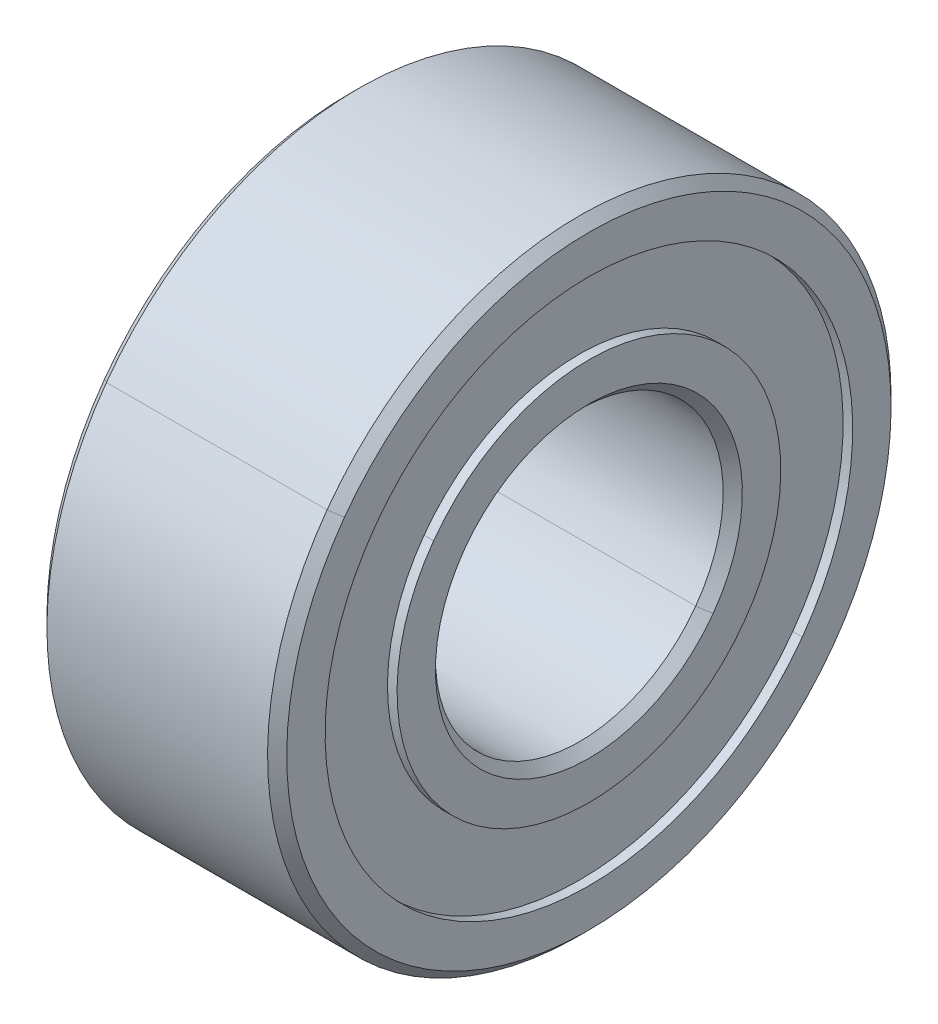
ISO-10303-21;
HEADER;
FILE_DESCRIPTION(('STEP AP214'),'2;1');
FILE_NAME('part.step','',(''),(''),'','','');
FILE_SCHEMA(('AUTOMOTIVE_DESIGN { 1 0 10303 214 1 1 1 1 }'));
ENDSEC;
DATA;
#1=APPLICATION_CONTEXT('core data for automotive mechanical design processes');
#2=APPLICATION_PROTOCOL_DEFINITION('international standard','automotive_design',2000,#1);
#3=PRODUCT_CONTEXT('',#1,'mechanical');
#4=PRODUCT('Part','Part','',(#3));
#5=PRODUCT_RELATED_PRODUCT_CATEGORY('part','',(#4));
#6=PRODUCT_DEFINITION_FORMATION('','',#4);
#7=PRODUCT_DEFINITION_CONTEXT('part definition',#1,'design');
#8=PRODUCT_DEFINITION('design','',#6,#7);
#9=PRODUCT_DEFINITION_SHAPE('','',#8);
#10=(LENGTH_UNIT() NAMED_UNIT(*) SI_UNIT(.MILLI.,.METRE.));
#11=(NAMED_UNIT(*) PLANE_ANGLE_UNIT() SI_UNIT($,.RADIAN.));
#12=(NAMED_UNIT(*) SI_UNIT($,.STERADIAN.) SOLID_ANGLE_UNIT());
#13=UNCERTAINTY_MEASURE_WITH_UNIT(LENGTH_MEASURE(1.E-05),#10,'distance_accuracy_value','');
#14=(GEOMETRIC_REPRESENTATION_CONTEXT(3) GLOBAL_UNCERTAINTY_ASSIGNED_CONTEXT((#13)) GLOBAL_UNIT_ASSIGNED_CONTEXT((#10,
#11,#12)) REPRESENTATION_CONTEXT('',''));
#15=CARTESIAN_POINT('',(0.,0.,0.));
#16=DIRECTION('',(0.,0.,1.));
#17=DIRECTION('',(1.,0.,0.));
#18=AXIS2_PLACEMENT_3D('',#15,#16,#17);
#19=CARTESIAN_POINT('',(99.025365407897,19.468323156225,35.373950164123));
#20=DIRECTION('',(-1.,0.,0.));
#21=DIRECTION('',(0.,-0.58749627689506,-0.809226868458063));
#22=AXIS2_PLACEMENT_3D('',#19,#20,#21);
#23=CONICAL_SURFACE('',#22,3.2,0.78539816339745);
#24=DIRECTION('',(-0.707106781186546,0.415422601314347,0.572209806205052));
#25=VECTOR('',#24,1.);
#26=CARTESIAN_POINT('',(99.025365407897,21.3483112422892,37.9634761431888));
#27=LINE('',#26,#25);
#28=CARTESIAN_POINT('',(99.225365407897,21.2308119869102,37.8016307694972));
#29=VERTEX_POINT('',#28);
#30=CARTESIAN_POINT('',(99.025365407897,21.3483112422892,37.9634761431888));
#31=VERTEX_POINT('',#30);
#32=EDGE_CURVE('E327',#29,#31,#27,.T.);
#33=ORIENTED_EDGE('',*,*,#32,.F.);
#34=CARTESIAN_POINT('',(99.225365407897,19.468323156225,35.373950164123));
#35=DIRECTION('',(-1.,0.,0.));
#36=DIRECTION('',(0.,0.58749627689506,0.809226868458063));
#37=AXIS2_PLACEMENT_3D('',#34,#35,#36);
#38=CIRCLE('',#37,3.);
#39=CARTESIAN_POINT('',(99.225365407897,17.7058343255398,32.9462695587488));
#40=VERTEX_POINT('',#39);
#41=EDGE_CURVE('E178',#40,#29,#38,.T.);
#42=ORIENTED_EDGE('',*,*,#41,.F.);
#43=DIRECTION('',(-0.707106781186546,-0.415422601314347,-0.572209806205052));
#44=VECTOR('',#43,1.);
#45=CARTESIAN_POINT('',(99.025365407897,17.5883350701608,32.7844241850572));
#46=LINE('',#45,#44);
#47=CARTESIAN_POINT('',(99.025365407897,17.5883350701608,32.7844241850572));
#48=VERTEX_POINT('',#47);
#49=EDGE_CURVE('E334',#40,#48,#46,.T.);
#50=ORIENTED_EDGE('',*,*,#49,.T.);
#51=CARTESIAN_POINT('',(99.025365407897,19.468323156225,35.373950164123));
#52=DIRECTION('',(1.,0.,0.));
#53=DIRECTION('',(0.,0.58749627689506,0.809226868458063));
#54=AXIS2_PLACEMENT_3D('',#51,#52,#53);
#55=CIRCLE('',#54,3.2);
#56=EDGE_CURVE('E225',#31,#48,#55,.T.);
#57=ORIENTED_EDGE('',*,*,#56,.F.);
#58=EDGE_LOOP('',(#33,#42,#50,#57));
#59=FACE_BOUND('',#58,.T.);
#60=ADVANCED_FACE('F50',(#59),#23,.F.);
#61=CARTESIAN_POINT('',(103.825365407897,19.468323156225,35.373950164123));
#62=DIRECTION('',(1.,0.,0.));
#63=DIRECTION('',(0.,0.58749627689506,0.809226868458063));
#64=AXIS2_PLACEMENT_3D('',#61,#62,#63);
#65=CONICAL_SURFACE('',#64,3.,0.785398163397457);
#66=DIRECTION('',(0.707106781186541,-0.415422601314351,-0.572209806205057));
#67=VECTOR('',#66,1.);
#68=CARTESIAN_POINT('',(103.825365407897,17.7058343255398,32.9462695587488));
#69=LINE('',#68,#67);
#70=CARTESIAN_POINT('',(103.825365407897,17.7058343255398,32.9462695587488));
#71=VERTEX_POINT('',#70);
#72=CARTESIAN_POINT('',(104.025365407897,17.5883350701608,32.7844241850572));
#73=VERTEX_POINT('',#72);
#74=EDGE_CURVE('E359',#71,#73,#69,.T.);
#75=ORIENTED_EDGE('',*,*,#74,.F.);
#76=CARTESIAN_POINT('',(103.825365407897,19.468323156225,35.373950164123));
#77=DIRECTION('',(1.,0.,0.));
#78=DIRECTION('',(0.,0.58749627689506,0.809226868458063));
#79=AXIS2_PLACEMENT_3D('',#76,#77,#78);
#80=CIRCLE('',#79,3.);
#81=CARTESIAN_POINT('',(103.825365407897,21.2308119869102,37.8016307694972));
#82=VERTEX_POINT('',#81);
#83=EDGE_CURVE('E248',#82,#71,#80,.T.);
#84=ORIENTED_EDGE('',*,*,#83,.F.);
#85=DIRECTION('',(0.707106781186541,0.415422601314351,0.572209806205057));
#86=VECTOR('',#85,1.);
#87=CARTESIAN_POINT('',(103.825365407897,21.2308119869102,37.8016307694972));
#88=LINE('',#87,#86);
#89=CARTESIAN_POINT('',(104.025365407897,21.3483112422892,37.9634761431888));
#90=VERTEX_POINT('',#89);
#91=EDGE_CURVE('E375',#82,#90,#88,.T.);
#92=ORIENTED_EDGE('',*,*,#91,.T.);
#93=CARTESIAN_POINT('',(104.025365407897,19.468323156225,35.373950164123));
#94=DIRECTION('',(-1.,0.,0.));
#95=DIRECTION('',(0.,0.58749627689506,0.809226868458063));
#96=AXIS2_PLACEMENT_3D('',#93,#94,#95);
#97=CIRCLE('',#96,3.2);
#98=EDGE_CURVE('E231',#73,#90,#97,.T.);
#99=ORIENTED_EDGE('',*,*,#98,.F.);
#100=EDGE_LOOP('',(#75,#84,#92,#99));
#101=FACE_BOUND('',#100,.T.);
#102=ADVANCED_FACE('F447',(#101),#65,.F.);
#103=CARTESIAN_POINT('',(99.225365407897,19.468323156225,35.373950164123));
#104=DIRECTION('',(1.,0.,0.));
#105=DIRECTION('',(0.,0.58749627689506,0.809226868458063));
#106=AXIS2_PLACEMENT_3D('',#103,#104,#105);
#107=CONICAL_SURFACE('',#106,6.5,0.78539816339745);
#108=DIRECTION('',(0.707106781186546,-0.415422601314347,-0.572209806205052));
#109=VECTOR('',#108,1.);
#110=CARTESIAN_POINT('',(99.225365407897,15.6495973564071,30.1139755191456));
#111=LINE('',#110,#109);
#112=CARTESIAN_POINT('',(99.025365407897,15.7670966117861,30.2758208928372));
#113=VERTEX_POINT('',#112);
#114=CARTESIAN_POINT('',(99.225365407897,15.6495973564071,30.1139755191456));
#115=VERTEX_POINT('',#114);
#116=EDGE_CURVE('E348',#113,#115,#111,.T.);
#117=ORIENTED_EDGE('',*,*,#116,.F.);
#118=CARTESIAN_POINT('',(99.025365407897,19.468323156225,35.373950164123));
#119=DIRECTION('',(-1.,0.,0.));
#120=DIRECTION('',(0.,0.58749627689506,0.809226868458063));
#121=AXIS2_PLACEMENT_3D('',#118,#119,#120);
#122=CIRCLE('',#121,6.3);
#123=CARTESIAN_POINT('',(99.025365407897,23.1695497006639,40.4720794354088));
#124=VERTEX_POINT('',#123);
#125=EDGE_CURVE('E211',#124,#113,#122,.T.);
#126=ORIENTED_EDGE('',*,*,#125,.F.);
#127=DIRECTION('',(0.707106781186546,0.415422601314347,0.572209806205052));
#128=VECTOR('',#127,1.);
#129=CARTESIAN_POINT('',(99.225365407897,23.2870489560429,40.6339248091004));
#130=LINE('',#129,#128);
#131=CARTESIAN_POINT('',(99.225365407897,23.2870489560429,40.6339248091004));
#132=VERTEX_POINT('',#131);
#133=EDGE_CURVE('E347',#124,#132,#130,.T.);
#134=ORIENTED_EDGE('',*,*,#133,.T.);
#135=CARTESIAN_POINT('',(99.225365407897,19.468323156225,35.373950164123));
#136=DIRECTION('',(1.,0.,0.));
#137=DIRECTION('',(0.,0.58749627689506,0.809226868458063));
#138=AXIS2_PLACEMENT_3D('',#135,#136,#137);
#139=CIRCLE('',#138,6.5);
#140=EDGE_CURVE('E244',#115,#132,#139,.T.);
#141=ORIENTED_EDGE('',*,*,#140,.F.);
#142=EDGE_LOOP('',(#117,#126,#134,#141));
#143=FACE_BOUND('',#142,.T.);
#144=ADVANCED_FACE('F451',(#143),#107,.T.);
#145=CARTESIAN_POINT('',(104.025365407897,19.468323156225,35.373950164123));
#146=DIRECTION('',(-1.,0.,0.));
#147=DIRECTION('',(0.,-0.58749627689506,-0.809226868458063));
#148=AXIS2_PLACEMENT_3D('',#145,#146,#147);
#149=CONICAL_SURFACE('',#148,6.3,0.785398163397448);
#150=DIRECTION('',(-0.707106781186548,0.415422601314347,0.572209806205051));
#151=VECTOR('',#150,1.);
#152=CARTESIAN_POINT('',(104.025365407897,23.1695497006639,40.4720794354088));
#153=LINE('',#152,#151);
#154=CARTESIAN_POINT('',(104.025365407897,23.1695497006639,40.4720794354088));
#155=VERTEX_POINT('',#154);
#156=CARTESIAN_POINT('',(103.825365407897,23.2870489560429,40.6339248091004));
#157=VERTEX_POINT('',#156);
#158=EDGE_CURVE('E356',#155,#157,#153,.T.);
#159=ORIENTED_EDGE('',*,*,#158,.F.);
#160=CARTESIAN_POINT('',(104.025365407897,19.468323156225,35.373950164123));
#161=DIRECTION('',(1.,0.,0.));
#162=DIRECTION('',(0.,0.58749627689506,0.809226868458063));
#163=AXIS2_PLACEMENT_3D('',#160,#161,#162);
#164=CIRCLE('',#163,6.3);
#165=CARTESIAN_POINT('',(104.025365407897,15.7670966117861,30.2758208928372));
#166=VERTEX_POINT('',#165);
#167=EDGE_CURVE('E212',#166,#155,#164,.T.);
#168=ORIENTED_EDGE('',*,*,#167,.F.);
#169=DIRECTION('',(-0.707106781186548,-0.415422601314347,-0.572209806205051));
#170=VECTOR('',#169,1.);
#171=CARTESIAN_POINT('',(104.025365407897,15.7670966117861,30.2758208928372));
#172=LINE('',#171,#170);
#173=CARTESIAN_POINT('',(103.825365407897,15.6495973564071,30.1139755191456));
#174=VERTEX_POINT('',#173);
#175=EDGE_CURVE('E355',#166,#174,#172,.T.);
#176=ORIENTED_EDGE('',*,*,#175,.T.);
#177=CARTESIAN_POINT('',(103.825365407897,19.468323156225,35.373950164123));
#178=DIRECTION('',(-1.,0.,0.));
#179=DIRECTION('',(0.,0.58749627689506,0.809226868458063));
#180=AXIS2_PLACEMENT_3D('',#177,#178,#179);
#181=CIRCLE('',#180,6.5);
#182=EDGE_CURVE('E240',#157,#174,#181,.T.);
#183=ORIENTED_EDGE('',*,*,#182,.F.);
#184=EDGE_LOOP('',(#159,#168,#176,#183));
#185=FACE_BOUND('',#184,.T.);
#186=ADVANCED_FACE('F441',(#185),#149,.T.);
#187=CARTESIAN_POINT('',(99.225365407897,19.468323156225,35.373950164123));
#188=DIRECTION('',(-1.,0.,0.));
#189=DIRECTION('',(0.,-0.58749627689506,-0.809226868458063));
#190=AXIS2_PLACEMENT_3D('',#187,#188,#189);
#191=CYLINDRICAL_SURFACE('',#190,4.);
#192=DIRECTION('',(-1.,0.,0.));
#193=VECTOR('',#192,1.);
#194=CARTESIAN_POINT('',(99.225365407897,21.8183082638052,38.6108576379553));
#195=LINE('',#194,#193);
#196=CARTESIAN_POINT('',(99.225365407897,21.8183082638052,38.6108576379553));
#197=VERTEX_POINT('',#196);
#198=CARTESIAN_POINT('',(99.025365407897,21.8183082638052,38.6108576379553));
#199=VERTEX_POINT('',#198);
#200=EDGE_CURVE('E398',#197,#199,#195,.T.);
#201=ORIENTED_EDGE('',*,*,#200,.F.);
#202=CARTESIAN_POINT('',(99.225365407897,19.468323156225,35.373950164123));
#203=DIRECTION('',(-1.,0.,0.));
#204=DIRECTION('',(0.,-0.58749627689506,-0.809226868458063));
#205=AXIS2_PLACEMENT_3D('',#202,#203,#204);
#206=CIRCLE('',#205,4.);
#207=CARTESIAN_POINT('',(99.225365407897,17.1183380486448,32.1370426902907));
#208=VERTEX_POINT('',#207);
#209=EDGE_CURVE('E11',#197,#208,#206,.T.);
#210=ORIENTED_EDGE('',*,*,#209,.T.);
#211=DIRECTION('',(-1.,0.,0.));
#212=VECTOR('',#211,1.);
#213=CARTESIAN_POINT('',(99.225365407897,17.1183380486448,32.1370426902907));
#214=LINE('',#213,#212);
#215=CARTESIAN_POINT('',(99.025365407897,17.1183380486448,32.1370426902907));
#216=VERTEX_POINT('',#215);
#217=EDGE_CURVE('E390',#208,#216,#214,.T.);
#218=ORIENTED_EDGE('',*,*,#217,.T.);
#219=CARTESIAN_POINT('',(99.025365407897,19.468323156225,35.373950164123));
#220=DIRECTION('',(-1.,0.,0.));
#221=DIRECTION('',(0.,-0.58749627689506,-0.809226868458063));
#222=AXIS2_PLACEMENT_3D('',#219,#220,#221);
#223=CIRCLE('',#222,4.);
#224=EDGE_CURVE('E224',#199,#216,#223,.T.);
#225=ORIENTED_EDGE('',*,*,#224,.F.);
#226=EDGE_LOOP('',(#201,#210,#218,#225));
#227=FACE_BOUND('',#226,.T.);
#228=ADVANCED_FACE('F433',(#227),#191,.T.);
#229=CARTESIAN_POINT('',(99.225365407897,19.468323156225,35.373950164123));
#230=DIRECTION('',(-1.,0.,0.));
#231=DIRECTION('',(0.,-0.58749627689506,-0.809226868458063));
#232=AXIS2_PLACEMENT_3D('',#229,#230,#231);
#233=PLANE('',#232);
#234=CARTESIAN_POINT('',(99.225365407897,19.468323156225,35.373950164123));
#235=DIRECTION('',(-1.,0.,0.));
#236=DIRECTION('',(0.,-0.58749627689506,-0.809226868458063));
#237=AXIS2_PLACEMENT_3D('',#234,#235,#236);
#238=CIRCLE('',#237,4.);
#239=EDGE_CURVE('E394',#208,#197,#238,.T.);
#240=ORIENTED_EDGE('',*,*,#239,.F.);
#241=ORIENTED_EDGE('',*,*,#209,.F.);
#242=EDGE_LOOP('',(#240,#241));
#243=FACE_BOUND('',#242,.T.);
#244=CARTESIAN_POINT('',(99.225365407897,19.468323156225,35.373950164123));
#245=DIRECTION('',(-1.,0.,0.));
#246=DIRECTION('',(0.,-0.58749627689506,-0.809226868458063));
#247=AXIS2_PLACEMENT_3D('',#244,#245,#246);
#248=CIRCLE('',#247,5.5);
#249=CARTESIAN_POINT('',(99.225365407897,16.2370936333022,30.9232023876037));
#250=VERTEX_POINT('',#249);
#251=CARTESIAN_POINT('',(99.225365407897,22.6995526791478,39.8246979406423));
#252=VERTEX_POINT('',#251);
#253=EDGE_CURVE('E58',#250,#252,#248,.T.);
#254=ORIENTED_EDGE('',*,*,#253,.T.);
#255=CARTESIAN_POINT('',(99.225365407897,19.468323156225,35.373950164123));
#256=DIRECTION('',(-1.,0.,0.));
#257=DIRECTION('',(0.,-0.58749627689506,-0.809226868458063));
#258=AXIS2_PLACEMENT_3D('',#255,#256,#257);
#259=CIRCLE('',#258,5.5);
#260=EDGE_CURVE('E386',#252,#250,#259,.T.);
#261=ORIENTED_EDGE('',*,*,#260,.T.);
#262=EDGE_LOOP('',(#254,#261));
#263=FACE_BOUND('',#262,.T.);
#264=ADVANCED_FACE('F431',(#243,#263),#233,.T.);
#265=CARTESIAN_POINT('',(99.225365407897,19.468323156225,35.373950164123));
#266=DIRECTION('',(-1.,0.,0.));
#267=DIRECTION('',(0.,-0.58749627689506,-0.809226868458063));
#268=AXIS2_PLACEMENT_3D('',#265,#266,#267);
#269=CYLINDRICAL_SURFACE('',#268,5.5);
#270=DIRECTION('',(-1.,0.,0.));
#271=VECTOR('',#270,1.);
#272=CARTESIAN_POINT('',(99.225365407897,22.6995526791478,39.8246979406423));
#273=LINE('',#272,#271);
#274=CARTESIAN_POINT('',(99.025365407897,22.6995526791478,39.8246979406423));
#275=VERTEX_POINT('',#274);
#276=EDGE_CURVE('E389',#252,#275,#273,.T.);
#277=ORIENTED_EDGE('',*,*,#276,.F.);
#278=ORIENTED_EDGE('',*,*,#253,.F.);
#279=DIRECTION('',(-1.,0.,0.));
#280=VECTOR('',#279,1.);
#281=CARTESIAN_POINT('',(99.225365407897,16.2370936333022,30.9232023876037));
#282=LINE('',#281,#280);
#283=CARTESIAN_POINT('',(99.025365407897,16.2370936333022,30.9232023876037));
#284=VERTEX_POINT('',#283);
#285=EDGE_CURVE('E269',#250,#284,#282,.T.);
#286=ORIENTED_EDGE('',*,*,#285,.T.);
#287=CARTESIAN_POINT('',(99.025365407897,19.468323156225,35.373950164123));
#288=DIRECTION('',(-1.,0.,0.));
#289=DIRECTION('',(0.,-0.58749627689506,-0.809226868458063));
#290=AXIS2_PLACEMENT_3D('',#287,#288,#289);
#291=CIRCLE('',#290,5.5);
#292=EDGE_CURVE('E237',#284,#275,#291,.T.);
#293=ORIENTED_EDGE('',*,*,#292,.T.);
#294=EDGE_LOOP('',(#277,#278,#286,#293));
#295=FACE_BOUND('',#294,.T.);
#296=ADVANCED_FACE('F428',(#295),#269,.F.);
#297=CARTESIAN_POINT('',(103.825365407897,19.468323156225,35.373950164123));
#298=DIRECTION('',(1.,0.,0.));
#299=DIRECTION('',(0.,0.58749627689506,0.809226868458063));
#300=AXIS2_PLACEMENT_3D('',#297,#298,#299);
#301=CYLINDRICAL_SURFACE('',#300,4.);
#302=DIRECTION('',(1.,0.,0.));
#303=VECTOR('',#302,1.);
#304=CARTESIAN_POINT('',(103.825365407897,17.1183380486448,32.1370426902907));
#305=LINE('',#304,#303);
#306=CARTESIAN_POINT('',(103.825365407897,17.1183380486448,32.1370426902907));
#307=VERTEX_POINT('',#306);
#308=CARTESIAN_POINT('',(104.025365407897,17.1183380486448,32.1370426902907));
#309=VERTEX_POINT('',#308);
#310=EDGE_CURVE('E270',#307,#309,#305,.T.);
#311=ORIENTED_EDGE('',*,*,#310,.F.);
#312=CARTESIAN_POINT('',(103.825365407897,19.468323156225,35.373950164123));
#313=DIRECTION('',(1.,0.,0.));
#314=DIRECTION('',(0.,0.58749627689506,0.809226868458063));
#315=AXIS2_PLACEMENT_3D('',#312,#313,#314);
#316=CIRCLE('',#315,4.);
#317=CARTESIAN_POINT('',(103.825365407897,21.8183082638052,38.6108576379553));
#318=VERTEX_POINT('',#317);
#319=EDGE_CURVE('E177',#307,#318,#316,.T.);
#320=ORIENTED_EDGE('',*,*,#319,.T.);
#321=DIRECTION('',(1.,0.,0.));
#322=VECTOR('',#321,1.);
#323=CARTESIAN_POINT('',(103.825365407897,21.8183082638052,38.6108576379553));
#324=LINE('',#323,#322);
#325=CARTESIAN_POINT('',(104.025365407897,21.8183082638052,38.6108576379553));
#326=VERTEX_POINT('',#325);
#327=EDGE_CURVE('E191',#318,#326,#324,.T.);
#328=ORIENTED_EDGE('',*,*,#327,.T.);
#329=CARTESIAN_POINT('',(104.025365407897,19.468323156225,35.373950164123));
#330=DIRECTION('',(1.,0.,0.));
#331=DIRECTION('',(0.,0.58749627689506,0.809226868458063));
#332=AXIS2_PLACEMENT_3D('',#329,#330,#331);
#333=CIRCLE('',#332,4.);
#334=EDGE_CURVE('E228',#309,#326,#333,.T.);
#335=ORIENTED_EDGE('',*,*,#334,.F.);
#336=EDGE_LOOP('',(#311,#320,#328,#335));
#337=FACE_BOUND('',#336,.T.);
#338=ADVANCED_FACE('F283',(#337),#301,.T.);
#339=CARTESIAN_POINT('',(103.825365407897,19.468323156225,35.373950164123));
#340=DIRECTION('',(1.,0.,0.));
#341=DIRECTION('',(0.,-0.809226868458063,0.58749627689506));
#342=AXIS2_PLACEMENT_3D('',#339,#340,#341);
#343=PLANE('',#342);
#344=CARTESIAN_POINT('',(103.825365407897,19.468323156225,35.373950164123));
#345=DIRECTION('',(1.,0.,0.));
#346=DIRECTION('',(0.,0.58749627689506,0.809226868458063));
#347=AXIS2_PLACEMENT_3D('',#344,#345,#346);
#348=CIRCLE('',#347,4.);
#349=EDGE_CURVE('E272',#318,#307,#348,.T.);
#350=ORIENTED_EDGE('',*,*,#349,.F.);
#351=ORIENTED_EDGE('',*,*,#319,.F.);
#352=EDGE_LOOP('',(#350,#351));
#353=FACE_BOUND('',#352,.T.);
#354=CARTESIAN_POINT('',(103.825365407897,19.468323156225,35.373950164123));
#355=DIRECTION('',(1.,0.,0.));
#356=DIRECTION('',(0.,0.58749627689506,0.809226868458063));
#357=AXIS2_PLACEMENT_3D('',#354,#355,#356);
#358=CIRCLE('',#357,5.5);
#359=CARTESIAN_POINT('',(103.825365407897,22.6995526791478,39.8246979406423));
#360=VERTEX_POINT('',#359);
#361=CARTESIAN_POINT('',(103.825365407897,16.2370936333022,30.9232023876037));
#362=VERTEX_POINT('',#361);
#363=EDGE_CURVE('E171',#360,#362,#358,.T.);
#364=ORIENTED_EDGE('',*,*,#363,.T.);
#365=CARTESIAN_POINT('',(103.825365407897,19.468323156225,35.373950164123));
#366=DIRECTION('',(1.,0.,0.));
#367=DIRECTION('',(0.,0.58749627689506,0.809226868458063));
#368=AXIS2_PLACEMENT_3D('',#365,#366,#367);
#369=CIRCLE('',#368,5.5);
#370=EDGE_CURVE('E174',#362,#360,#369,.T.);
#371=ORIENTED_EDGE('',*,*,#370,.T.);
#372=EDGE_LOOP('',(#364,#371));
#373=FACE_BOUND('',#372,.T.);
#374=ADVANCED_FACE('F172',(#353,#373),#343,.T.);
#375=CARTESIAN_POINT('',(103.825365407897,19.468323156225,35.373950164123));
#376=DIRECTION('',(1.,0.,0.));
#377=DIRECTION('',(0.,0.58749627689506,0.809226868458063));
#378=AXIS2_PLACEMENT_3D('',#375,#376,#377);
#379=CYLINDRICAL_SURFACE('',#378,5.5);
#380=DIRECTION('',(1.,0.,0.));
#381=VECTOR('',#380,1.);
#382=CARTESIAN_POINT('',(103.825365407897,16.2370936333022,30.9232023876037));
#383=LINE('',#382,#381);
#384=CARTESIAN_POINT('',(104.025365407897,16.2370936333022,30.9232023876037));
#385=VERTEX_POINT('',#384);
#386=EDGE_CURVE('E181',#362,#385,#383,.T.);
#387=ORIENTED_EDGE('',*,*,#386,.F.);
#388=ORIENTED_EDGE('',*,*,#363,.F.);
#389=DIRECTION('',(1.,0.,0.));
#390=VECTOR('',#389,1.);
#391=CARTESIAN_POINT('',(103.825365407897,22.6995526791478,39.8246979406423));
#392=LINE('',#391,#390);
#393=CARTESIAN_POINT('',(104.025365407897,22.6995526791478,39.8246979406423));
#394=VERTEX_POINT('',#393);
#395=EDGE_CURVE('E189',#360,#394,#392,.T.);
#396=ORIENTED_EDGE('',*,*,#395,.T.);
#397=CARTESIAN_POINT('',(104.025365407897,19.468323156225,35.373950164123));
#398=DIRECTION('',(1.,0.,0.));
#399=DIRECTION('',(0.,0.58749627689506,0.809226868458063));
#400=AXIS2_PLACEMENT_3D('',#397,#398,#399);
#401=CIRCLE('',#400,5.5);
#402=EDGE_CURVE('E67',#394,#385,#401,.T.);
#403=ORIENTED_EDGE('',*,*,#402,.T.);
#404=EDGE_LOOP('',(#387,#388,#396,#403));
#405=FACE_BOUND('',#404,.T.);
#406=ADVANCED_FACE('F182',(#405),#379,.F.);
#407=CARTESIAN_POINT('',(104.025365407897,19.468323156225,35.373950164123));
#408=DIRECTION('',(-1.,0.,0.));
#409=DIRECTION('',(0.,-0.58749627689506,-0.809226868458063));
#410=AXIS2_PLACEMENT_3D('',#407,#408,#409);
#411=CYLINDRICAL_SURFACE('',#410,3.);
#412=DIRECTION('',(-1.,0.,0.));
#413=VECTOR('',#412,1.);
#414=CARTESIAN_POINT('',(104.025365407897,21.2308119869102,37.8016307694972));
#415=LINE('',#414,#413);
#416=EDGE_CURVE('E204',#82,#29,#415,.T.);
#417=ORIENTED_EDGE('',*,*,#416,.F.);
#418=ORIENTED_EDGE('',*,*,#83,.T.);
#419=DIRECTION('',(-1.,0.,0.));
#420=VECTOR('',#419,1.);
#421=CARTESIAN_POINT('',(104.025365407897,17.7058343255398,32.9462695587488));
#422=LINE('',#421,#420);
#423=EDGE_CURVE('E208',#71,#40,#422,.T.);
#424=ORIENTED_EDGE('',*,*,#423,.T.);
#425=ORIENTED_EDGE('',*,*,#41,.T.);
#426=EDGE_LOOP('',(#417,#418,#424,#425));
#427=FACE_BOUND('',#426,.T.);
#428=ADVANCED_FACE('F314',(#427),#411,.F.);
#429=CARTESIAN_POINT('',(104.025365407897,19.468323156225,35.373950164123));
#430=DIRECTION('',(-1.,0.,0.));
#431=DIRECTION('',(0.,-0.58749627689506,-0.809226868458063));
#432=AXIS2_PLACEMENT_3D('',#429,#430,#431);
#433=CYLINDRICAL_SURFACE('',#432,6.5);
#434=DIRECTION('',(-1.,0.,0.));
#435=VECTOR('',#434,1.);
#436=CARTESIAN_POINT('',(104.025365407897,23.2870489560429,40.6339248091004));
#437=LINE('',#436,#435);
#438=EDGE_CURVE('E216',#157,#132,#437,.T.);
#439=ORIENTED_EDGE('',*,*,#438,.F.);
#440=ORIENTED_EDGE('',*,*,#182,.T.);
#441=DIRECTION('',(-1.,0.,0.));
#442=VECTOR('',#441,1.);
#443=CARTESIAN_POINT('',(104.025365407897,15.6495973564071,30.1139755191456));
#444=LINE('',#443,#442);
#445=EDGE_CURVE('E220',#174,#115,#444,.T.);
#446=ORIENTED_EDGE('',*,*,#445,.T.);
#447=ORIENTED_EDGE('',*,*,#140,.T.);
#448=EDGE_LOOP('',(#439,#440,#446,#447));
#449=FACE_BOUND('',#448,.T.);
#450=ADVANCED_FACE('F482',(#449),#433,.T.);
#451=CARTESIAN_POINT('',(99.025365407897,19.468323156225,35.373950164123));
#452=DIRECTION('',(1.,0.,0.));
#453=DIRECTION('',(0.,-0.809226868458063,0.58749627689506));
#454=AXIS2_PLACEMENT_3D('',#451,#452,#453);
#455=PLANE('',#454);
#456=ORIENTED_EDGE('',*,*,#292,.F.);
#457=CARTESIAN_POINT('',(99.025365407897,19.468323156225,35.373950164123));
#458=DIRECTION('',(-1.,0.,0.));
#459=DIRECTION('',(0.,-0.58749627689506,-0.809226868458063));
#460=AXIS2_PLACEMENT_3D('',#457,#458,#459);
#461=CIRCLE('',#460,5.5);
#462=EDGE_CURVE('E418',#275,#284,#461,.T.);
#463=ORIENTED_EDGE('',*,*,#462,.F.);
#464=EDGE_LOOP('',(#456,#463));
#465=FACE_BOUND('',#464,.T.);
#466=ORIENTED_EDGE('',*,*,#125,.T.);
#467=CARTESIAN_POINT('',(99.025365407897,19.468323156225,35.373950164123));
#468=DIRECTION('',(-1.,0.,0.));
#469=DIRECTION('',(0.,0.58749627689506,0.809226868458063));
#470=AXIS2_PLACEMENT_3D('',#467,#468,#469);
#471=CIRCLE('',#470,6.3);
#472=EDGE_CURVE('E367',#113,#124,#471,.T.);
#473=ORIENTED_EDGE('',*,*,#472,.T.);
#474=EDGE_LOOP('',(#466,#473));
#475=FACE_BOUND('',#474,.T.);
#476=ADVANCED_FACE('F473',(#465,#475),#455,.F.);
#477=CARTESIAN_POINT('',(104.025365407897,19.468323156225,35.373950164123));
#478=DIRECTION('',(1.,0.,0.));
#479=DIRECTION('',(0.,-0.809226868458063,0.58749627689506));
#480=AXIS2_PLACEMENT_3D('',#477,#478,#479);
#481=PLANE('',#480);
#482=ORIENTED_EDGE('',*,*,#402,.F.);
#483=CARTESIAN_POINT('',(104.025365407897,19.468323156225,35.373950164123));
#484=DIRECTION('',(1.,0.,0.));
#485=DIRECTION('',(0.,0.58749627689506,0.809226868458063));
#486=AXIS2_PLACEMENT_3D('',#483,#484,#485);
#487=CIRCLE('',#486,5.5);
#488=EDGE_CURVE('E186',#385,#394,#487,.T.);
#489=ORIENTED_EDGE('',*,*,#488,.F.);
#490=EDGE_LOOP('',(#482,#489));
#491=FACE_BOUND('',#490,.T.);
#492=ORIENTED_EDGE('',*,*,#167,.T.);
#493=CARTESIAN_POINT('',(104.025365407897,19.468323156225,35.373950164123));
#494=DIRECTION('',(1.,0.,0.));
#495=DIRECTION('',(0.,0.58749627689506,0.809226868458063));
#496=AXIS2_PLACEMENT_3D('',#493,#494,#495);
#497=CIRCLE('',#496,6.3);
#498=EDGE_CURVE('E363',#155,#166,#497,.T.);
#499=ORIENTED_EDGE('',*,*,#498,.T.);
#500=EDGE_LOOP('',(#492,#499));
#501=FACE_BOUND('',#500,.T.);
#502=ADVANCED_FACE('F471',(#491,#501),#481,.T.);
#503=CARTESIAN_POINT('',(104.025365407897,19.468323156225,35.373950164123));
#504=DIRECTION('',(1.,0.,0.));
#505=DIRECTION('',(0.,-0.809226868458063,0.58749627689506));
#506=AXIS2_PLACEMENT_3D('',#503,#504,#505);
#507=PLANE('',#506);
#508=CARTESIAN_POINT('',(104.025365407897,19.468323156225,35.373950164123));
#509=DIRECTION('',(-1.,0.,0.));
#510=DIRECTION('',(0.,0.58749627689506,0.809226868458063));
#511=AXIS2_PLACEMENT_3D('',#508,#509,#510);
#512=CIRCLE('',#511,3.2);
#513=EDGE_CURVE('E371',#90,#73,#512,.T.);
#514=ORIENTED_EDGE('',*,*,#513,.T.);
#515=ORIENTED_EDGE('',*,*,#98,.T.);
#516=EDGE_LOOP('',(#514,#515));
#517=FACE_BOUND('',#516,.T.);
#518=CARTESIAN_POINT('',(104.025365407897,19.468323156225,35.373950164123));
#519=DIRECTION('',(1.,0.,0.));
#520=DIRECTION('',(0.,0.58749627689506,0.809226868458063));
#521=AXIS2_PLACEMENT_3D('',#518,#519,#520);
#522=CIRCLE('',#521,4.);
#523=EDGE_CURVE('E197',#326,#309,#522,.T.);
#524=ORIENTED_EDGE('',*,*,#523,.T.);
#525=ORIENTED_EDGE('',*,*,#334,.T.);
#526=EDGE_LOOP('',(#524,#525));
#527=FACE_BOUND('',#526,.T.);
#528=ADVANCED_FACE('F278',(#517,#527),#507,.T.);
#529=CARTESIAN_POINT('',(99.025365407897,19.468323156225,35.373950164123));
#530=DIRECTION('',(1.,0.,0.));
#531=DIRECTION('',(0.,-0.809226868458063,0.58749627689506));
#532=AXIS2_PLACEMENT_3D('',#529,#530,#531);
#533=PLANE('',#532);
#534=CARTESIAN_POINT('',(99.025365407897,19.468323156225,35.373950164123));
#535=DIRECTION('',(1.,0.,0.));
#536=DIRECTION('',(0.,0.58749627689506,0.809226868458063));
#537=AXIS2_PLACEMENT_3D('',#534,#535,#536);
#538=CIRCLE('',#537,3.2);
#539=EDGE_CURVE('E331',#48,#31,#538,.T.);
#540=ORIENTED_EDGE('',*,*,#539,.T.);
#541=ORIENTED_EDGE('',*,*,#56,.T.);
#542=EDGE_LOOP('',(#540,#541));
#543=FACE_BOUND('',#542,.T.);
#544=CARTESIAN_POINT('',(99.025365407897,19.468323156225,35.373950164123));
#545=DIRECTION('',(-1.,0.,0.));
#546=DIRECTION('',(0.,-0.58749627689506,-0.809226868458063));
#547=AXIS2_PLACEMENT_3D('',#544,#545,#546);
#548=CIRCLE('',#547,4.);
#549=EDGE_CURVE('E408',#216,#199,#548,.T.);
#550=ORIENTED_EDGE('',*,*,#549,.T.);
#551=ORIENTED_EDGE('',*,*,#224,.T.);
#552=EDGE_LOOP('',(#550,#551));
#553=FACE_BOUND('',#552,.T.);
#554=ADVANCED_FACE('F479',(#543,#553),#533,.F.);
#555=CARTESIAN_POINT('',(104.025365407897,19.468323156225,35.373950164123));
#556=DIRECTION('',(-1.,0.,0.));
#557=DIRECTION('',(0.,-0.58749627689506,-0.809226868458063));
#558=AXIS2_PLACEMENT_3D('',#555,#556,#557);
#559=CYLINDRICAL_SURFACE('',#558,6.5);
#560=CARTESIAN_POINT('',(103.825365407897,19.468323156225,35.373950164123));
#561=DIRECTION('',(-1.,0.,0.));
#562=DIRECTION('',(0.,0.58749627689506,0.809226868458063));
#563=AXIS2_PLACEMENT_3D('',#560,#561,#562);
#564=CIRCLE('',#563,6.5);
#565=EDGE_CURVE('E351',#174,#157,#564,.T.);
#566=ORIENTED_EDGE('',*,*,#565,.T.);
#567=ORIENTED_EDGE('',*,*,#438,.T.);
#568=CARTESIAN_POINT('',(99.225365407897,19.468323156225,35.373950164123));
#569=DIRECTION('',(1.,0.,0.));
#570=DIRECTION('',(0.,0.58749627689506,0.809226868458063));
#571=AXIS2_PLACEMENT_3D('',#568,#569,#570);
#572=CIRCLE('',#571,6.5);
#573=EDGE_CURVE('E343',#132,#115,#572,.T.);
#574=ORIENTED_EDGE('',*,*,#573,.T.);
#575=ORIENTED_EDGE('',*,*,#445,.F.);
#576=EDGE_LOOP('',(#566,#567,#574,#575));
#577=FACE_BOUND('',#576,.T.);
#578=ADVANCED_FACE('F495',(#577),#559,.T.);
#579=CARTESIAN_POINT('',(104.025365407897,19.468323156225,35.373950164123));
#580=DIRECTION('',(-1.,0.,0.));
#581=DIRECTION('',(0.,-0.58749627689506,-0.809226868458063));
#582=AXIS2_PLACEMENT_3D('',#579,#580,#581);
#583=CYLINDRICAL_SURFACE('',#582,3.);
#584=CARTESIAN_POINT('',(103.825365407897,19.468323156225,35.373950164123));
#585=DIRECTION('',(1.,0.,0.));
#586=DIRECTION('',(0.,0.58749627689506,0.809226868458063));
#587=AXIS2_PLACEMENT_3D('',#584,#585,#586);
#588=CIRCLE('',#587,3.);
#589=EDGE_CURVE('E325',#71,#82,#588,.T.);
#590=ORIENTED_EDGE('',*,*,#589,.T.);
#591=ORIENTED_EDGE('',*,*,#416,.T.);
#592=CARTESIAN_POINT('',(99.225365407897,19.468323156225,35.373950164123));
#593=DIRECTION('',(-1.,0.,0.));
#594=DIRECTION('',(0.,0.58749627689506,0.809226868458063));
#595=AXIS2_PLACEMENT_3D('',#592,#593,#594);
#596=CIRCLE('',#595,3.);
#597=EDGE_CURVE('E323',#29,#40,#596,.T.);
#598=ORIENTED_EDGE('',*,*,#597,.T.);
#599=ORIENTED_EDGE('',*,*,#423,.F.);
#600=EDGE_LOOP('',(#590,#591,#598,#599));
#601=FACE_BOUND('',#600,.T.);
#602=ADVANCED_FACE('F321',(#601),#583,.F.);
#603=CARTESIAN_POINT('',(103.825365407897,19.468323156225,35.373950164123));
#604=DIRECTION('',(1.,0.,0.));
#605=DIRECTION('',(0.,0.58749627689506,0.809226868458063));
#606=AXIS2_PLACEMENT_3D('',#603,#604,#605);
#607=CYLINDRICAL_SURFACE('',#606,5.5);
#608=ORIENTED_EDGE('',*,*,#370,.F.);
#609=ORIENTED_EDGE('',*,*,#386,.T.);
#610=ORIENTED_EDGE('',*,*,#488,.T.);
#611=ORIENTED_EDGE('',*,*,#395,.F.);
#612=EDGE_LOOP('',(#608,#609,#610,#611));
#613=FACE_BOUND('',#612,.T.);
#614=ADVANCED_FACE('F188',(#613),#607,.F.);
#615=CARTESIAN_POINT('',(103.825365407897,19.468323156225,35.373950164123));
#616=DIRECTION('',(1.,0.,0.));
#617=DIRECTION('',(0.,0.58749627689506,0.809226868458063));
#618=AXIS2_PLACEMENT_3D('',#615,#616,#617);
#619=CYLINDRICAL_SURFACE('',#618,4.);
#620=ORIENTED_EDGE('',*,*,#349,.T.);
#621=ORIENTED_EDGE('',*,*,#310,.T.);
#622=ORIENTED_EDGE('',*,*,#523,.F.);
#623=ORIENTED_EDGE('',*,*,#327,.F.);
#624=EDGE_LOOP('',(#620,#621,#622,#623));
#625=FACE_BOUND('',#624,.T.);
#626=ADVANCED_FACE('F281',(#625),#619,.T.);
#627=CARTESIAN_POINT('',(99.225365407897,19.468323156225,35.373950164123));
#628=DIRECTION('',(-1.,0.,0.));
#629=DIRECTION('',(0.,-0.58749627689506,-0.809226868458063));
#630=AXIS2_PLACEMENT_3D('',#627,#628,#629);
#631=CYLINDRICAL_SURFACE('',#630,5.5);
#632=ORIENTED_EDGE('',*,*,#260,.F.);
#633=ORIENTED_EDGE('',*,*,#276,.T.);
#634=ORIENTED_EDGE('',*,*,#462,.T.);
#635=ORIENTED_EDGE('',*,*,#285,.F.);
#636=EDGE_LOOP('',(#632,#633,#634,#635));
#637=FACE_BOUND('',#636,.T.);
#638=ADVANCED_FACE('F430',(#637),#631,.F.);
#639=CARTESIAN_POINT('',(99.225365407897,19.468323156225,35.373950164123));
#640=DIRECTION('',(-1.,0.,0.));
#641=DIRECTION('',(0.,-0.58749627689506,-0.809226868458063));
#642=AXIS2_PLACEMENT_3D('',#639,#640,#641);
#643=CYLINDRICAL_SURFACE('',#642,4.);
#644=ORIENTED_EDGE('',*,*,#239,.T.);
#645=ORIENTED_EDGE('',*,*,#200,.T.);
#646=ORIENTED_EDGE('',*,*,#549,.F.);
#647=ORIENTED_EDGE('',*,*,#217,.F.);
#648=EDGE_LOOP('',(#644,#645,#646,#647));
#649=FACE_BOUND('',#648,.T.);
#650=ADVANCED_FACE('F591',(#649),#643,.T.);
#651=CARTESIAN_POINT('',(104.025365407897,19.468323156225,35.373950164123));
#652=DIRECTION('',(-1.,0.,0.));
#653=DIRECTION('',(0.,-0.58749627689506,-0.809226868458063));
#654=AXIS2_PLACEMENT_3D('',#651,#652,#653);
#655=CONICAL_SURFACE('',#654,6.3,0.785398163397448);
#656=ORIENTED_EDGE('',*,*,#498,.F.);
#657=ORIENTED_EDGE('',*,*,#158,.T.);
#658=ORIENTED_EDGE('',*,*,#565,.F.);
#659=ORIENTED_EDGE('',*,*,#175,.F.);
#660=EDGE_LOOP('',(#656,#657,#658,#659));
#661=FACE_BOUND('',#660,.T.);
#662=ADVANCED_FACE('F469',(#661),#655,.T.);
#663=CARTESIAN_POINT('',(99.225365407897,19.468323156225,35.373950164123));
#664=DIRECTION('',(1.,0.,0.));
#665=DIRECTION('',(0.,0.58749627689506,0.809226868458063));
#666=AXIS2_PLACEMENT_3D('',#663,#664,#665);
#667=CONICAL_SURFACE('',#666,6.5,0.78539816339745);
#668=ORIENTED_EDGE('',*,*,#472,.F.);
#669=ORIENTED_EDGE('',*,*,#116,.T.);
#670=ORIENTED_EDGE('',*,*,#573,.F.);
#671=ORIENTED_EDGE('',*,*,#133,.F.);
#672=EDGE_LOOP('',(#668,#669,#670,#671));
#673=FACE_BOUND('',#672,.T.);
#674=ADVANCED_FACE('F610',(#673),#667,.T.);
#675=CARTESIAN_POINT('',(103.825365407897,19.468323156225,35.373950164123));
#676=DIRECTION('',(1.,0.,0.));
#677=DIRECTION('',(0.,0.58749627689506,0.809226868458063));
#678=AXIS2_PLACEMENT_3D('',#675,#676,#677);
#679=CONICAL_SURFACE('',#678,3.,0.785398163397457);
#680=ORIENTED_EDGE('',*,*,#589,.F.);
#681=ORIENTED_EDGE('',*,*,#74,.T.);
#682=ORIENTED_EDGE('',*,*,#513,.F.);
#683=ORIENTED_EDGE('',*,*,#91,.F.);
#684=EDGE_LOOP('',(#680,#681,#682,#683));
#685=FACE_BOUND('',#684,.T.);
#686=ADVANCED_FACE('F620',(#685),#679,.F.);
#687=CARTESIAN_POINT('',(99.025365407897,19.468323156225,35.373950164123));
#688=DIRECTION('',(-1.,0.,0.));
#689=DIRECTION('',(0.,-0.58749627689506,-0.809226868458063));
#690=AXIS2_PLACEMENT_3D('',#687,#688,#689);
#691=CONICAL_SURFACE('',#690,3.2,0.78539816339745);
#692=ORIENTED_EDGE('',*,*,#597,.F.);
#693=ORIENTED_EDGE('',*,*,#32,.T.);
#694=ORIENTED_EDGE('',*,*,#539,.F.);
#695=ORIENTED_EDGE('',*,*,#49,.F.);
#696=EDGE_LOOP('',(#692,#693,#694,#695));
#697=FACE_BOUND('',#696,.T.);
#698=ADVANCED_FACE('F333',(#697),#691,.F.);
#699=CLOSED_SHELL('',(#60,#102,#144,#186,#228,#264,#296,#338,#374,#406,#428,#450,#476,#502,#528,
#554,#578,#602,#614,#626,#638,#650,#662,#674,#686,#698));
#700=MANIFOLD_SOLID_BREP('B2',#699);
#701=ADVANCED_BREP_SHAPE_REPRESENTATION('',(#18,#700),#14);
#702=SHAPE_DEFINITION_REPRESENTATION(#9,#701);
ENDSEC;
END-ISO-10303-21;
